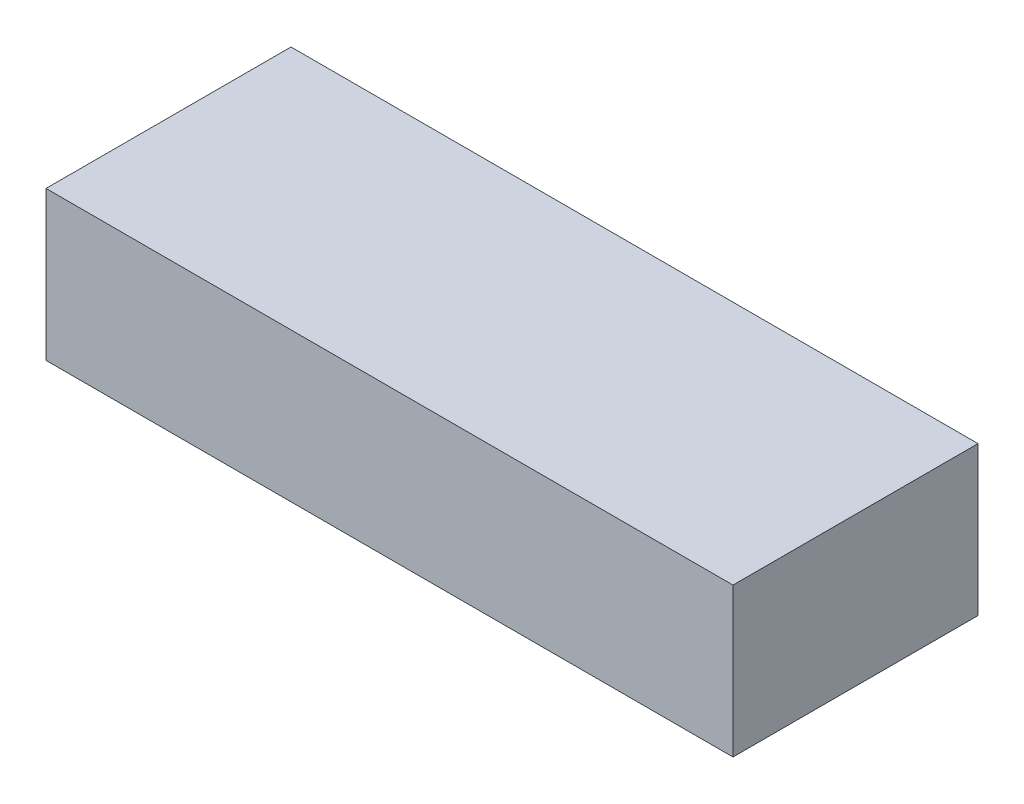
ISO-10303-21;
HEADER;
FILE_DESCRIPTION(('STEP AP214'),'2;1');
FILE_NAME('part.step','',(''),(''),'','','');
FILE_SCHEMA(('AUTOMOTIVE_DESIGN { 1 0 10303 214 1 1 1 1 }'));
ENDSEC;
DATA;
#1=APPLICATION_CONTEXT('core data for automotive mechanical design processes');
#2=APPLICATION_PROTOCOL_DEFINITION('international standard','automotive_design',2000,#1);
#3=PRODUCT_CONTEXT('',#1,'mechanical');
#4=PRODUCT('Part','Part','',(#3));
#5=PRODUCT_RELATED_PRODUCT_CATEGORY('part','',(#4));
#6=PRODUCT_DEFINITION_FORMATION('','',#4);
#7=PRODUCT_DEFINITION_CONTEXT('part definition',#1,'design');
#8=PRODUCT_DEFINITION('design','',#6,#7);
#9=PRODUCT_DEFINITION_SHAPE('','',#8);
#10=(LENGTH_UNIT() NAMED_UNIT(*) SI_UNIT(.MILLI.,.METRE.));
#11=(NAMED_UNIT(*) PLANE_ANGLE_UNIT() SI_UNIT($,.RADIAN.));
#12=(NAMED_UNIT(*) SI_UNIT($,.STERADIAN.) SOLID_ANGLE_UNIT());
#13=UNCERTAINTY_MEASURE_WITH_UNIT(LENGTH_MEASURE(1.E-05),#10,'distance_accuracy_value','');
#14=(GEOMETRIC_REPRESENTATION_CONTEXT(3) GLOBAL_UNCERTAINTY_ASSIGNED_CONTEXT((#13)) GLOBAL_UNIT_ASSIGNED_CONTEXT((#10,
#11,#12)) REPRESENTATION_CONTEXT('',''));
#15=CARTESIAN_POINT('',(0.,0.,0.));
#16=DIRECTION('',(0.,0.,1.));
#17=DIRECTION('',(1.,0.,0.));
#18=AXIS2_PLACEMENT_3D('',#15,#16,#17);
#19=CARTESIAN_POINT('',(-71.5,31.,25.5));
#20=DIRECTION('',(1.,0.,0.));
#21=DIRECTION('',(0.,0.,-1.));
#22=AXIS2_PLACEMENT_3D('',#19,#20,#21);
#23=PLANE('',#22);
#24=DIRECTION('',(0.,0.,1.));
#25=VECTOR('',#24,1.);
#26=CARTESIAN_POINT('',(-71.5,0.,25.5));
#27=LINE('',#26,#25);
#28=CARTESIAN_POINT('',(-71.5,0.,-25.5));
#29=VERTEX_POINT('',#28);
#30=CARTESIAN_POINT('',(-71.5,0.,25.5));
#31=VERTEX_POINT('',#30);
#32=EDGE_CURVE('E95',#29,#31,#27,.T.);
#33=ORIENTED_EDGE('',*,*,#32,.T.);
#34=DIRECTION('',(0.,-1.,0.));
#35=VECTOR('',#34,1.);
#36=CARTESIAN_POINT('',(-71.5,31.,25.5));
#37=LINE('',#36,#35);
#38=CARTESIAN_POINT('',(-71.5,31.,25.5));
#39=VERTEX_POINT('',#38);
#40=EDGE_CURVE('E11',#39,#31,#37,.T.);
#41=ORIENTED_EDGE('',*,*,#40,.F.);
#42=DIRECTION('',(0.,0.,1.));
#43=VECTOR('',#42,1.);
#44=CARTESIAN_POINT('',(-71.5,31.,25.5));
#45=LINE('',#44,#43);
#46=CARTESIAN_POINT('',(-71.5,31.,-25.5));
#47=VERTEX_POINT('',#46);
#48=EDGE_CURVE('E83',#47,#39,#45,.T.);
#49=ORIENTED_EDGE('',*,*,#48,.F.);
#50=DIRECTION('',(0.,-1.,0.));
#51=VECTOR('',#50,1.);
#52=CARTESIAN_POINT('',(-71.5,31.,-25.5));
#53=LINE('',#52,#51);
#54=EDGE_CURVE('E91',#47,#29,#53,.T.);
#55=ORIENTED_EDGE('',*,*,#54,.T.);
#56=EDGE_LOOP('',(#33,#41,#49,#55));
#57=FACE_BOUND('',#56,.T.);
#58=ADVANCED_FACE('F32',(#57),#23,.F.);
#59=CARTESIAN_POINT('',(71.5,31.,25.5));
#60=DIRECTION('',(0.,0.,-1.));
#61=DIRECTION('',(-1.,0.,0.));
#62=AXIS2_PLACEMENT_3D('',#59,#60,#61);
#63=PLANE('',#62);
#64=DIRECTION('',(1.,0.,0.));
#65=VECTOR('',#64,1.);
#66=CARTESIAN_POINT('',(71.5,0.,25.5));
#67=LINE('',#66,#65);
#68=CARTESIAN_POINT('',(71.5,0.,25.5));
#69=VERTEX_POINT('',#68);
#70=EDGE_CURVE('E87',#31,#69,#67,.T.);
#71=ORIENTED_EDGE('',*,*,#70,.T.);
#72=DIRECTION('',(0.,-1.,0.));
#73=VECTOR('',#72,1.);
#74=CARTESIAN_POINT('',(71.5,31.,25.5));
#75=LINE('',#74,#73);
#76=CARTESIAN_POINT('',(71.5,31.,25.5));
#77=VERTEX_POINT('',#76);
#78=EDGE_CURVE('E40',#77,#69,#75,.T.);
#79=ORIENTED_EDGE('',*,*,#78,.F.);
#80=DIRECTION('',(1.,0.,0.));
#81=VECTOR('',#80,1.);
#82=CARTESIAN_POINT('',(71.5,31.,25.5));
#83=LINE('',#82,#81);
#84=EDGE_CURVE('E78',#39,#77,#83,.T.);
#85=ORIENTED_EDGE('',*,*,#84,.F.);
#86=ORIENTED_EDGE('',*,*,#40,.T.);
#87=EDGE_LOOP('',(#71,#79,#85,#86));
#88=FACE_BOUND('',#87,.T.);
#89=ADVANCED_FACE('F86',(#88),#63,.F.);
#90=CARTESIAN_POINT('',(71.5,31.,25.5));
#91=DIRECTION('',(-1.,0.,0.));
#92=DIRECTION('',(0.,0.,1.));
#93=AXIS2_PLACEMENT_3D('',#90,#91,#92);
#94=PLANE('',#93);
#95=DIRECTION('',(0.,0.,-1.));
#96=VECTOR('',#95,1.);
#97=CARTESIAN_POINT('',(71.5,0.,25.5));
#98=LINE('',#97,#96);
#99=CARTESIAN_POINT('',(71.5,0.,-25.5));
#100=VERTEX_POINT('',#99);
#101=EDGE_CURVE('E65',#69,#100,#98,.T.);
#102=ORIENTED_EDGE('',*,*,#101,.T.);
#103=DIRECTION('',(0.,-1.,0.));
#104=VECTOR('',#103,1.);
#105=CARTESIAN_POINT('',(71.5,31.,-25.5));
#106=LINE('',#105,#104);
#107=CARTESIAN_POINT('',(71.5,31.,-25.5));
#108=VERTEX_POINT('',#107);
#109=EDGE_CURVE('E88',#108,#100,#106,.T.);
#110=ORIENTED_EDGE('',*,*,#109,.F.);
#111=DIRECTION('',(0.,0.,-1.));
#112=VECTOR('',#111,1.);
#113=CARTESIAN_POINT('',(71.5,31.,25.5));
#114=LINE('',#113,#112);
#115=EDGE_CURVE('E81',#77,#108,#114,.T.);
#116=ORIENTED_EDGE('',*,*,#115,.F.);
#117=ORIENTED_EDGE('',*,*,#78,.T.);
#118=EDGE_LOOP('',(#102,#110,#116,#117));
#119=FACE_BOUND('',#118,.T.);
#120=ADVANCED_FACE('F89',(#119),#94,.F.);
#121=CARTESIAN_POINT('',(71.5,31.,-25.5));
#122=DIRECTION('',(0.,0.,1.));
#123=DIRECTION('',(1.,0.,0.));
#124=AXIS2_PLACEMENT_3D('',#121,#122,#123);
#125=PLANE('',#124);
#126=DIRECTION('',(-1.,0.,0.));
#127=VECTOR('',#126,1.);
#128=CARTESIAN_POINT('',(71.5,0.,-25.5));
#129=LINE('',#128,#127);
#130=EDGE_CURVE('E71',#100,#29,#129,.T.);
#131=ORIENTED_EDGE('',*,*,#130,.T.);
#132=ORIENTED_EDGE('',*,*,#54,.F.);
#133=DIRECTION('',(-1.,0.,0.));
#134=VECTOR('',#133,1.);
#135=CARTESIAN_POINT('',(71.5,31.,-25.5));
#136=LINE('',#135,#134);
#137=EDGE_CURVE('E48',#108,#47,#136,.T.);
#138=ORIENTED_EDGE('',*,*,#137,.F.);
#139=ORIENTED_EDGE('',*,*,#109,.T.);
#140=EDGE_LOOP('',(#131,#132,#138,#139));
#141=FACE_BOUND('',#140,.T.);
#142=ADVANCED_FACE('F102',(#141),#125,.F.);
#143=CARTESIAN_POINT('',(0.,31.,0.));
#144=DIRECTION('',(0.,1.,0.));
#145=DIRECTION('',(0.,0.,1.));
#146=AXIS2_PLACEMENT_3D('',#143,#144,#145);
#147=PLANE('',#146);
#148=ORIENTED_EDGE('',*,*,#48,.T.);
#149=ORIENTED_EDGE('',*,*,#84,.T.);
#150=ORIENTED_EDGE('',*,*,#115,.T.);
#151=ORIENTED_EDGE('',*,*,#137,.T.);
#152=EDGE_LOOP('',(#148,#149,#150,#151));
#153=FACE_BOUND('',#152,.T.);
#154=ADVANCED_FACE('F79',(#153),#147,.T.);
#155=CARTESIAN_POINT('',(0.,0.,0.));
#156=DIRECTION('',(0.,1.,0.));
#157=DIRECTION('',(0.,0.,1.));
#158=AXIS2_PLACEMENT_3D('',#155,#156,#157);
#159=PLANE('',#158);
#160=ORIENTED_EDGE('',*,*,#32,.F.);
#161=ORIENTED_EDGE('',*,*,#130,.F.);
#162=ORIENTED_EDGE('',*,*,#101,.F.);
#163=ORIENTED_EDGE('',*,*,#70,.F.);
#164=EDGE_LOOP('',(#160,#161,#162,#163));
#165=FACE_BOUND('',#164,.T.);
#166=ADVANCED_FACE('F105',(#165),#159,.F.);
#167=CLOSED_SHELL('',(#58,#89,#120,#142,#154,#166));
#168=MANIFOLD_SOLID_BREP('B2',#167);
#169=ADVANCED_BREP_SHAPE_REPRESENTATION('',(#18,#168),#14);
#170=SHAPE_DEFINITION_REPRESENTATION(#9,#169);
ENDSEC;
END-ISO-10303-21;
